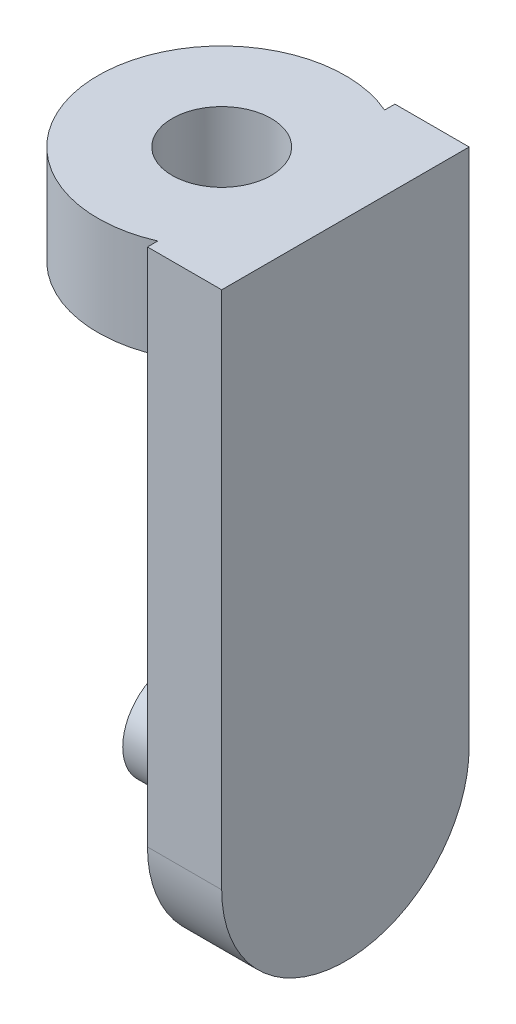
ISO-10303-21;
HEADER;
FILE_DESCRIPTION(('STEP AP214'),'2;1');
FILE_NAME('part.step','',(''),(''),'','','');
FILE_SCHEMA(('AUTOMOTIVE_DESIGN { 1 0 10303 214 1 1 1 1 }'));
ENDSEC;
DATA;
#1=APPLICATION_CONTEXT('core data for automotive mechanical design processes');
#2=APPLICATION_PROTOCOL_DEFINITION('international standard','automotive_design',2000,#1);
#3=PRODUCT_CONTEXT('',#1,'mechanical');
#4=PRODUCT('Part','Part','',(#3));
#5=PRODUCT_RELATED_PRODUCT_CATEGORY('part','',(#4));
#6=PRODUCT_DEFINITION_FORMATION('','',#4);
#7=PRODUCT_DEFINITION_CONTEXT('part definition',#1,'design');
#8=PRODUCT_DEFINITION('design','',#6,#7);
#9=PRODUCT_DEFINITION_SHAPE('','',#8);
#10=(LENGTH_UNIT() NAMED_UNIT(*) SI_UNIT(.MILLI.,.METRE.));
#11=(NAMED_UNIT(*) PLANE_ANGLE_UNIT() SI_UNIT($,.RADIAN.));
#12=(NAMED_UNIT(*) SI_UNIT($,.STERADIAN.) SOLID_ANGLE_UNIT());
#13=UNCERTAINTY_MEASURE_WITH_UNIT(LENGTH_MEASURE(1.E-05),#10,'distance_accuracy_value','');
#14=(GEOMETRIC_REPRESENTATION_CONTEXT(3) GLOBAL_UNCERTAINTY_ASSIGNED_CONTEXT((#13)) GLOBAL_UNIT_ASSIGNED_CONTEXT((#10,
#11,#12)) REPRESENTATION_CONTEXT('',''));
#15=CARTESIAN_POINT('',(0.,0.,0.));
#16=DIRECTION('',(0.,0.,1.));
#17=DIRECTION('',(1.,0.,0.));
#18=AXIS2_PLACEMENT_3D('',#15,#16,#17);
#19=CARTESIAN_POINT('',(0.,1.,0.));
#20=DIRECTION('',(0.,1.,0.));
#21=DIRECTION('',(0.,0.,1.));
#22=AXIS2_PLACEMENT_3D('',#19,#20,#21);
#23=PLANE('',#22);
#24=CARTESIAN_POINT('',(0.,1.,0.));
#25=DIRECTION('',(0.,1.,0.));
#26=DIRECTION('',(0.,0.,1.));
#27=AXIS2_PLACEMENT_3D('',#24,#25,#26);
#28=CIRCLE('',#27,1.);
#29=CARTESIAN_POINT('',(0.,1.,1.));
#30=VERTEX_POINT('',#29);
#31=EDGE_CURVE('E144',#30,#30,#28,.T.);
#32=ORIENTED_EDGE('',*,*,#31,.F.);
#33=EDGE_LOOP('',(#32));
#34=FACE_BOUND('',#33,.T.);
#35=DIRECTION('',(0.,0.,1.));
#36=VECTOR('',#35,1.);
#37=CARTESIAN_POINT('',(1.,1.,2.5));
#38=LINE('',#37,#36);
#39=CARTESIAN_POINT('',(1.,1.,-2.5));
#40=VERTEX_POINT('',#39);
#41=CARTESIAN_POINT('',(1.,1.,-2.29128784747792));
#42=VERTEX_POINT('',#41);
#43=EDGE_CURVE('E103',#40,#42,#38,.T.);
#44=ORIENTED_EDGE('',*,*,#43,.T.);
#45=CARTESIAN_POINT('',(0.,1.,0.));
#46=DIRECTION('',(0.,1.,0.));
#47=DIRECTION('',(0.,0.,1.));
#48=AXIS2_PLACEMENT_3D('',#45,#46,#47);
#49=CIRCLE('',#48,2.5);
#50=CARTESIAN_POINT('',(1.,1.,2.29128784747792));
#51=VERTEX_POINT('',#50);
#52=EDGE_CURVE('E11',#42,#51,#49,.T.);
#53=ORIENTED_EDGE('',*,*,#52,.T.);
#54=CARTESIAN_POINT('',(1.,1.,2.5));
#55=VERTEX_POINT('',#54);
#56=EDGE_CURVE('E52',#51,#55,#38,.T.);
#57=ORIENTED_EDGE('',*,*,#56,.T.);
#58=DIRECTION('',(1.,0.,0.));
#59=VECTOR('',#58,1.);
#60=CARTESIAN_POINT('',(1.,1.,2.5));
#61=LINE('',#60,#59);
#62=CARTESIAN_POINT('',(2.5,1.,2.5));
#63=VERTEX_POINT('',#62);
#64=EDGE_CURVE('E115',#55,#63,#61,.T.);
#65=ORIENTED_EDGE('',*,*,#64,.T.);
#66=DIRECTION('',(0.,0.,1.));
#67=VECTOR('',#66,1.);
#68=CARTESIAN_POINT('',(2.5,1.,2.5));
#69=LINE('',#68,#67);
#70=CARTESIAN_POINT('',(2.5,1.,-2.5));
#71=VERTEX_POINT('',#70);
#72=EDGE_CURVE('E116',#71,#63,#69,.T.);
#73=ORIENTED_EDGE('',*,*,#72,.F.);
#74=DIRECTION('',(1.,0.,0.));
#75=VECTOR('',#74,1.);
#76=CARTESIAN_POINT('',(1.,1.,-2.5));
#77=LINE('',#76,#75);
#78=EDGE_CURVE('E135',#40,#71,#77,.T.);
#79=ORIENTED_EDGE('',*,*,#78,.F.);
#80=EDGE_LOOP('',(#44,#53,#57,#65,#73,#79));
#81=FACE_BOUND('',#80,.T.);
#82=ADVANCED_FACE('F37',(#34,#81),#23,.T.);
#83=CARTESIAN_POINT('',(0.,-1.,0.));
#84=DIRECTION('',(0.,1.,0.));
#85=DIRECTION('',(0.,0.,1.));
#86=AXIS2_PLACEMENT_3D('',#83,#84,#85);
#87=PLANE('',#86);
#88=CARTESIAN_POINT('',(0.,-1.,0.));
#89=DIRECTION('',(0.,1.,0.));
#90=DIRECTION('',(0.,0.,1.));
#91=AXIS2_PLACEMENT_3D('',#88,#89,#90);
#92=CIRCLE('',#91,2.5);
#93=CARTESIAN_POINT('',(1.,-1.,-2.29128784747792));
#94=VERTEX_POINT('',#93);
#95=CARTESIAN_POINT('',(1.,-1.,2.29128784747792));
#96=VERTEX_POINT('',#95);
#97=EDGE_CURVE('E41',#94,#96,#92,.T.);
#98=ORIENTED_EDGE('',*,*,#97,.F.);
#99=DIRECTION('',(0.,0.,1.));
#100=VECTOR('',#99,1.);
#101=CARTESIAN_POINT('',(1.,-1.,0.));
#102=LINE('',#101,#100);
#103=CARTESIAN_POINT('',(1.,-1.,0.));
#104=VERTEX_POINT('',#103);
#105=EDGE_CURVE('E59',#94,#104,#102,.T.);
#106=ORIENTED_EDGE('',*,*,#105,.T.);
#107=CARTESIAN_POINT('',(0.,-1.,0.));
#108=DIRECTION('',(0.,1.,0.));
#109=DIRECTION('',(0.,0.,1.));
#110=AXIS2_PLACEMENT_3D('',#107,#108,#109);
#111=CIRCLE('',#110,1.);
#112=EDGE_CURVE('E147',#104,#104,#111,.T.);
#113=ORIENTED_EDGE('',*,*,#112,.T.);
#114=EDGE_CURVE('E134',#104,#96,#102,.T.);
#115=ORIENTED_EDGE('',*,*,#114,.T.);
#116=EDGE_LOOP('',(#98,#106,#113,#115));
#117=FACE_BOUND('',#116,.T.);
#118=ADVANCED_FACE('F152',(#117),#87,.F.);
#119=CARTESIAN_POINT('',(0.,1.,0.));
#120=DIRECTION('',(0.,-1.,0.));
#121=DIRECTION('',(0.,0.,-1.));
#122=AXIS2_PLACEMENT_3D('',#119,#120,#121);
#123=CYLINDRICAL_SURFACE('',#122,2.5);
#124=ORIENTED_EDGE('',*,*,#52,.F.);
#125=DIRECTION('',(0.,-1.,0.));
#126=VECTOR('',#125,1.);
#127=CARTESIAN_POINT('',(1.,1.,-2.29128784747792));
#128=LINE('',#127,#126);
#129=EDGE_CURVE('E142',#42,#94,#128,.T.);
#130=ORIENTED_EDGE('',*,*,#129,.T.);
#131=ORIENTED_EDGE('',*,*,#97,.T.);
#132=DIRECTION('',(0.,-1.,0.));
#133=VECTOR('',#132,1.);
#134=CARTESIAN_POINT('',(1.,1.,2.29128784747792));
#135=LINE('',#134,#133);
#136=EDGE_CURVE('E140',#96,#51,#135,.F.);
#137=ORIENTED_EDGE('',*,*,#136,.T.);
#138=EDGE_LOOP('',(#124,#130,#131,#137));
#139=FACE_BOUND('',#138,.T.);
#140=ADVANCED_FACE('F39',(#139),#123,.T.);
#141=CARTESIAN_POINT('',(0.,1.,0.));
#142=DIRECTION('',(0.,-1.,0.));
#143=DIRECTION('',(0.,0.,-1.));
#144=AXIS2_PLACEMENT_3D('',#141,#142,#143);
#145=CYLINDRICAL_SURFACE('',#144,1.);
#146=ORIENTED_EDGE('',*,*,#112,.F.);
#147=EDGE_LOOP('',(#146));
#148=FACE_BOUND('',#147,.T.);
#149=ORIENTED_EDGE('',*,*,#31,.T.);
#150=EDGE_LOOP('',(#149));
#151=FACE_BOUND('',#150,.T.);
#152=ADVANCED_FACE('F184',(#148,#151),#145,.F.);
#153=CARTESIAN_POINT('',(1.,-9.5,0.));
#154=DIRECTION('',(-1.,0.,0.));
#155=DIRECTION('',(0.,0.,1.));
#156=AXIS2_PLACEMENT_3D('',#153,#154,#155);
#157=PLANE('',#156);
#158=CARTESIAN_POINT('',(1.,-9.5,0.));
#159=DIRECTION('',(-1.,0.,0.));
#160=DIRECTION('',(0.,0.,1.));
#161=AXIS2_PLACEMENT_3D('',#158,#159,#160);
#162=CIRCLE('',#161,1.);
#163=CARTESIAN_POINT('',(1.,-9.5,1.));
#164=VERTEX_POINT('',#163);
#165=EDGE_CURVE('E121',#164,#164,#162,.T.);
#166=ORIENTED_EDGE('',*,*,#165,.F.);
#167=EDGE_LOOP('',(#166));
#168=FACE_BOUND('',#167,.T.);
#169=ORIENTED_EDGE('',*,*,#105,.F.);
#170=ORIENTED_EDGE('',*,*,#129,.F.);
#171=ORIENTED_EDGE('',*,*,#43,.F.);
#172=DIRECTION('',(0.,1.,0.));
#173=VECTOR('',#172,1.);
#174=CARTESIAN_POINT('',(1.,1.,-2.5));
#175=LINE('',#174,#173);
#176=CARTESIAN_POINT('',(1.,-9.5,-2.5));
#177=VERTEX_POINT('',#176);
#178=EDGE_CURVE('E110',#177,#40,#175,.T.);
#179=ORIENTED_EDGE('',*,*,#178,.F.);
#180=CARTESIAN_POINT('',(1.,-9.5,0.));
#181=DIRECTION('',(1.,0.,0.));
#182=DIRECTION('',(0.,0.,1.));
#183=AXIS2_PLACEMENT_3D('',#180,#181,#182);
#184=CIRCLE('',#183,2.5);
#185=CARTESIAN_POINT('',(1.,-9.5,2.5));
#186=VERTEX_POINT('',#185);
#187=EDGE_CURVE('E95',#186,#177,#184,.T.);
#188=ORIENTED_EDGE('',*,*,#187,.F.);
#189=DIRECTION('',(0.,-1.,0.));
#190=VECTOR('',#189,1.);
#191=CARTESIAN_POINT('',(1.,1.,2.5));
#192=LINE('',#191,#190);
#193=EDGE_CURVE('E107',#55,#186,#192,.T.);
#194=ORIENTED_EDGE('',*,*,#193,.F.);
#195=ORIENTED_EDGE('',*,*,#56,.F.);
#196=ORIENTED_EDGE('',*,*,#136,.F.);
#197=ORIENTED_EDGE('',*,*,#114,.F.);
#198=EDGE_LOOP('',(#169,#170,#171,#179,#188,#194,#195,#196,#197));
#199=FACE_BOUND('',#198,.T.);
#200=ADVANCED_FACE('F106',(#168,#199),#157,.T.);
#201=CARTESIAN_POINT('',(1.,1.,2.5));
#202=DIRECTION('',(0.,0.,1.));
#203=DIRECTION('',(0.,-1.,0.));
#204=AXIS2_PLACEMENT_3D('',#201,#202,#203);
#205=PLANE('',#204);
#206=DIRECTION('',(0.,-1.,0.));
#207=VECTOR('',#206,1.);
#208=CARTESIAN_POINT('',(2.5,1.,2.5));
#209=LINE('',#208,#207);
#210=CARTESIAN_POINT('',(2.5,-9.5,2.5));
#211=VERTEX_POINT('',#210);
#212=EDGE_CURVE('E127',#63,#211,#209,.T.);
#213=ORIENTED_EDGE('',*,*,#212,.F.);
#214=ORIENTED_EDGE('',*,*,#64,.F.);
#215=ORIENTED_EDGE('',*,*,#193,.T.);
#216=DIRECTION('',(1.,0.,0.));
#217=VECTOR('',#216,1.);
#218=CARTESIAN_POINT('',(1.,-9.5,2.5));
#219=LINE('',#218,#217);
#220=EDGE_CURVE('E92',#186,#211,#219,.T.);
#221=ORIENTED_EDGE('',*,*,#220,.T.);
#222=EDGE_LOOP('',(#213,#214,#215,#221));
#223=FACE_BOUND('',#222,.T.);
#224=ADVANCED_FACE('F113',(#223),#205,.T.);
#225=CARTESIAN_POINT('',(1.,1.,-2.5));
#226=DIRECTION('',(0.,0.,-1.));
#227=DIRECTION('',(0.,1.,0.));
#228=AXIS2_PLACEMENT_3D('',#225,#226,#227);
#229=PLANE('',#228);
#230=DIRECTION('',(0.,1.,0.));
#231=VECTOR('',#230,1.);
#232=CARTESIAN_POINT('',(2.5,1.,-2.5));
#233=LINE('',#232,#231);
#234=CARTESIAN_POINT('',(2.5,-9.5,-2.5));
#235=VERTEX_POINT('',#234);
#236=EDGE_CURVE('E118',#235,#71,#233,.T.);
#237=ORIENTED_EDGE('',*,*,#236,.F.);
#238=DIRECTION('',(1.,0.,0.));
#239=VECTOR('',#238,1.);
#240=CARTESIAN_POINT('',(1.,-9.5,-2.5));
#241=LINE('',#240,#239);
#242=EDGE_CURVE('E102',#177,#235,#241,.T.);
#243=ORIENTED_EDGE('',*,*,#242,.F.);
#244=ORIENTED_EDGE('',*,*,#178,.T.);
#245=ORIENTED_EDGE('',*,*,#78,.T.);
#246=EDGE_LOOP('',(#237,#243,#244,#245));
#247=FACE_BOUND('',#246,.T.);
#248=ADVANCED_FACE('F160',(#247),#229,.T.);
#249=CARTESIAN_POINT('',(1.,-9.5,0.));
#250=DIRECTION('',(1.,0.,0.));
#251=DIRECTION('',(0.,0.,-1.));
#252=AXIS2_PLACEMENT_3D('',#249,#250,#251);
#253=CYLINDRICAL_SURFACE('',#252,2.5);
#254=CARTESIAN_POINT('',(2.5,-9.5,0.));
#255=DIRECTION('',(1.,0.,0.));
#256=DIRECTION('',(0.,0.,1.));
#257=AXIS2_PLACEMENT_3D('',#254,#255,#256);
#258=CIRCLE('',#257,2.5);
#259=EDGE_CURVE('E97',#211,#235,#258,.T.);
#260=ORIENTED_EDGE('',*,*,#259,.F.);
#261=ORIENTED_EDGE('',*,*,#220,.F.);
#262=ORIENTED_EDGE('',*,*,#187,.T.);
#263=ORIENTED_EDGE('',*,*,#242,.T.);
#264=EDGE_LOOP('',(#260,#261,#262,#263));
#265=FACE_BOUND('',#264,.T.);
#266=ADVANCED_FACE('F94',(#265),#253,.T.);
#267=CARTESIAN_POINT('',(2.5,-9.5,0.));
#268=DIRECTION('',(-1.,0.,0.));
#269=DIRECTION('',(0.,0.,1.));
#270=AXIS2_PLACEMENT_3D('',#267,#268,#269);
#271=PLANE('',#270);
#272=ORIENTED_EDGE('',*,*,#212,.T.);
#273=ORIENTED_EDGE('',*,*,#259,.T.);
#274=ORIENTED_EDGE('',*,*,#236,.T.);
#275=ORIENTED_EDGE('',*,*,#72,.T.);
#276=EDGE_LOOP('',(#272,#273,#274,#275));
#277=FACE_BOUND('',#276,.T.);
#278=ADVANCED_FACE('F162',(#277),#271,.F.);
#279=CARTESIAN_POINT('',(-1.,-9.5,0.));
#280=DIRECTION('',(1.,0.,0.));
#281=DIRECTION('',(0.,0.,-1.));
#282=AXIS2_PLACEMENT_3D('',#279,#280,#281);
#283=CYLINDRICAL_SURFACE('',#282,1.);
#284=CARTESIAN_POINT('',(-1.,-9.5,0.));
#285=DIRECTION('',(-1.,0.,0.));
#286=DIRECTION('',(0.,0.,1.));
#287=AXIS2_PLACEMENT_3D('',#284,#285,#286);
#288=CIRCLE('',#287,1.);
#289=CARTESIAN_POINT('',(-1.,-9.5,1.));
#290=VERTEX_POINT('',#289);
#291=EDGE_CURVE('E129',#290,#290,#288,.T.);
#292=ORIENTED_EDGE('',*,*,#291,.F.);
#293=EDGE_LOOP('',(#292));
#294=FACE_BOUND('',#293,.T.);
#295=ORIENTED_EDGE('',*,*,#165,.T.);
#296=EDGE_LOOP('',(#295));
#297=FACE_BOUND('',#296,.T.);
#298=ADVANCED_FACE('F164',(#294,#297),#283,.T.);
#299=CARTESIAN_POINT('',(-1.,-9.5,0.));
#300=DIRECTION('',(-1.,0.,0.));
#301=DIRECTION('',(0.,0.,1.));
#302=AXIS2_PLACEMENT_3D('',#299,#300,#301);
#303=PLANE('',#302);
#304=ORIENTED_EDGE('',*,*,#291,.T.);
#305=EDGE_LOOP('',(#304));
#306=FACE_BOUND('',#305,.T.);
#307=ADVANCED_FACE('F170',(#306),#303,.T.);
#308=CLOSED_SHELL('',(#82,#118,#140,#152,#200,#224,#248,#266,#278,#298,#307));
#309=MANIFOLD_SOLID_BREP('B2',#308);
#310=ADVANCED_BREP_SHAPE_REPRESENTATION('',(#18,#309),#14);
#311=SHAPE_DEFINITION_REPRESENTATION(#9,#310);
ENDSEC;
END-ISO-10303-21;
